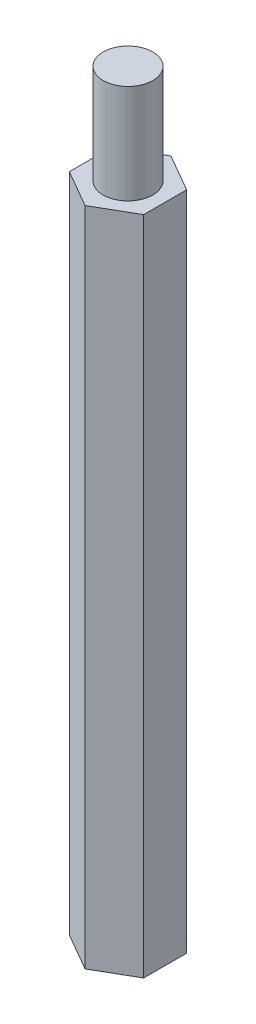
ISO-10303-21;
HEADER;
FILE_DESCRIPTION(('STEP AP214'),'2;1');
FILE_NAME('part.step','',(''),(''),'','','');
FILE_SCHEMA(('AUTOMOTIVE_DESIGN { 1 0 10303 214 1 1 1 1 }'));
ENDSEC;
DATA;
#1=APPLICATION_CONTEXT('core data for automotive mechanical design processes');
#2=APPLICATION_PROTOCOL_DEFINITION('international standard','automotive_design',2000,#1);
#3=PRODUCT_CONTEXT('',#1,'mechanical');
#4=PRODUCT('Part','Part','',(#3));
#5=PRODUCT_RELATED_PRODUCT_CATEGORY('part','',(#4));
#6=PRODUCT_DEFINITION_FORMATION('','',#4);
#7=PRODUCT_DEFINITION_CONTEXT('part definition',#1,'design');
#8=PRODUCT_DEFINITION('design','',#6,#7);
#9=PRODUCT_DEFINITION_SHAPE('','',#8);
#10=(LENGTH_UNIT() NAMED_UNIT(*) SI_UNIT(.MILLI.,.METRE.));
#11=(NAMED_UNIT(*) PLANE_ANGLE_UNIT() SI_UNIT($,.RADIAN.));
#12=(NAMED_UNIT(*) SI_UNIT($,.STERADIAN.) SOLID_ANGLE_UNIT());
#13=UNCERTAINTY_MEASURE_WITH_UNIT(LENGTH_MEASURE(1.E-05),#10,'distance_accuracy_value','');
#14=(GEOMETRIC_REPRESENTATION_CONTEXT(3) GLOBAL_UNCERTAINTY_ASSIGNED_CONTEXT((#13)) GLOBAL_UNIT_ASSIGNED_CONTEXT((#10,
#11,#12)) REPRESENTATION_CONTEXT('',''));
#15=CARTESIAN_POINT('',(0.,0.,0.));
#16=DIRECTION('',(0.,0.,1.));
#17=DIRECTION('',(1.,0.,0.));
#18=AXIS2_PLACEMENT_3D('',#15,#16,#17);
#19=CARTESIAN_POINT('',(0.,46.,0.));
#20=DIRECTION('',(0.,-1.,0.));
#21=DIRECTION('',(0.,0.,-1.));
#22=AXIS2_PLACEMENT_3D('',#19,#20,#21);
#23=CYLINDRICAL_SURFACE('',#22,1.5);
#24=CARTESIAN_POINT('',(0.,46.,0.));
#25=DIRECTION('',(0.,1.,0.));
#26=DIRECTION('',(0.,0.,1.));
#27=AXIS2_PLACEMENT_3D('',#24,#25,#26);
#28=CIRCLE('',#27,1.5);
#29=CARTESIAN_POINT('',(0.,46.,1.5));
#30=VERTEX_POINT('',#29);
#31=EDGE_CURVE('E11',#30,#30,#28,.T.);
#32=ORIENTED_EDGE('',*,*,#31,.F.);
#33=EDGE_LOOP('',(#32));
#34=FACE_BOUND('',#33,.T.);
#35=CARTESIAN_POINT('',(0.,40.,0.));
#36=DIRECTION('',(0.,1.,0.));
#37=DIRECTION('',(0.,0.,1.));
#38=AXIS2_PLACEMENT_3D('',#35,#36,#37);
#39=CIRCLE('',#38,1.5);
#40=CARTESIAN_POINT('',(0.,40.,1.5));
#41=VERTEX_POINT('',#40);
#42=EDGE_CURVE('E43',#41,#41,#39,.T.);
#43=ORIENTED_EDGE('',*,*,#42,.T.);
#44=EDGE_LOOP('',(#43));
#45=FACE_BOUND('',#44,.T.);
#46=ADVANCED_FACE('F40',(#34,#45),#23,.T.);
#47=CARTESIAN_POINT('',(0.,46.,0.));
#48=DIRECTION('',(0.,1.,0.));
#49=DIRECTION('',(0.,0.,1.));
#50=AXIS2_PLACEMENT_3D('',#47,#48,#49);
#51=PLANE('',#50);
#52=ORIENTED_EDGE('',*,*,#31,.T.);
#53=EDGE_LOOP('',(#52));
#54=FACE_BOUND('',#53,.T.);
#55=ADVANCED_FACE('F55',(#54),#51,.T.);
#56=CARTESIAN_POINT('',(0.,40.,0.));
#57=DIRECTION('',(0.,1.,0.));
#58=DIRECTION('',(0.,0.,1.));
#59=AXIS2_PLACEMENT_3D('',#56,#57,#58);
#60=PLANE('',#59);
#61=ORIENTED_EDGE('',*,*,#42,.F.);
#62=EDGE_LOOP('',(#61));
#63=FACE_BOUND('',#62,.T.);
#64=ADVANCED_FACE('F53',(#63),#60,.F.);
#65=CLOSED_SHELL('',(#46,#55,#64));
#66=MANIFOLD_SOLID_BREP('B2',#65);
#67=CARTESIAN_POINT('',(2.24999999999998,40.,-1.29903810567668));
#68=DIRECTION('',(-0.499999999999995,0.,0.866025403784442));
#69=DIRECTION('',(0.866025403784442,0.,0.499999999999995));
#70=AXIS2_PLACEMENT_3D('',#67,#68,#69);
#71=PLANE('',#70);
#72=DIRECTION('',(-0.866025403784441,0.,-0.499999999999995));
#73=VECTOR('',#72,1.);
#74=CARTESIAN_POINT('',(2.24999999999998,0.,-1.29903810567668));
#75=LINE('',#74,#73);
#76=CARTESIAN_POINT('',(2.24999999999998,0.,-1.29903810567668));
#77=VERTEX_POINT('',#76);
#78=CARTESIAN_POINT('',(0.,0.,-2.59807621135331));
#79=VERTEX_POINT('',#78);
#80=EDGE_CURVE('E164',#77,#79,#75,.T.);
#81=ORIENTED_EDGE('',*,*,#80,.T.);
#82=DIRECTION('',(0.,-1.,0.));
#83=VECTOR('',#82,1.);
#84=CARTESIAN_POINT('',(0.,40.,-2.59807621135331));
#85=LINE('',#84,#83);
#86=CARTESIAN_POINT('',(0.,40.,-2.59807621135331));
#87=VERTEX_POINT('',#86);
#88=EDGE_CURVE('E38',#87,#79,#85,.T.);
#89=ORIENTED_EDGE('',*,*,#88,.F.);
#90=DIRECTION('',(-0.866025403784441,0.,-0.499999999999995));
#91=VECTOR('',#90,1.);
#92=CARTESIAN_POINT('',(2.24999999999998,40.,-1.29903810567668));
#93=LINE('',#92,#91);
#94=CARTESIAN_POINT('',(2.24999999999998,40.,-1.29903810567668));
#95=VERTEX_POINT('',#94);
#96=EDGE_CURVE('E175',#95,#87,#93,.T.);
#97=ORIENTED_EDGE('',*,*,#96,.F.);
#98=DIRECTION('',(0.,-1.,0.));
#99=VECTOR('',#98,1.);
#100=CARTESIAN_POINT('',(2.24999999999998,40.,-1.29903810567668));
#101=LINE('',#100,#99);
#102=EDGE_CURVE('E160',#95,#77,#101,.T.);
#103=ORIENTED_EDGE('',*,*,#102,.T.);
#104=EDGE_LOOP('',(#81,#89,#97,#103));
#105=FACE_BOUND('',#104,.T.);
#106=ADVANCED_FACE('F80',(#105),#71,.F.);
#107=CARTESIAN_POINT('',(0.,40.,-2.59807621135331));
#108=DIRECTION('',(0.500000000000001,0.,0.866025403784438));
#109=DIRECTION('',(0.866025403784438,0.,-0.500000000000001));
#110=AXIS2_PLACEMENT_3D('',#107,#108,#109);
#111=PLANE('',#110);
#112=DIRECTION('',(-0.866025403784438,0.,0.500000000000001));
#113=VECTOR('',#112,1.);
#114=CARTESIAN_POINT('',(0.,0.,-2.59807621135331));
#115=LINE('',#114,#113);
#116=CARTESIAN_POINT('',(-2.25,0.,-1.29903810567665));
#117=VERTEX_POINT('',#116);
#118=EDGE_CURVE('E167',#79,#117,#115,.T.);
#119=ORIENTED_EDGE('',*,*,#118,.T.);
#120=DIRECTION('',(0.,-1.,0.));
#121=VECTOR('',#120,1.);
#122=CARTESIAN_POINT('',(-2.25,40.,-1.29903810567665));
#123=LINE('',#122,#121);
#124=CARTESIAN_POINT('',(-2.25,40.,-1.29903810567665));
#125=VERTEX_POINT('',#124);
#126=EDGE_CURVE('E88',#125,#117,#123,.T.);
#127=ORIENTED_EDGE('',*,*,#126,.F.);
#128=DIRECTION('',(-0.866025403784438,0.,0.500000000000001));
#129=VECTOR('',#128,1.);
#130=CARTESIAN_POINT('',(0.,40.,-2.59807621135331));
#131=LINE('',#130,#129);
#132=EDGE_CURVE('E133',#87,#125,#131,.T.);
#133=ORIENTED_EDGE('',*,*,#132,.F.);
#134=ORIENTED_EDGE('',*,*,#88,.T.);
#135=EDGE_LOOP('',(#119,#127,#133,#134));
#136=FACE_BOUND('',#135,.T.);
#137=ADVANCED_FACE('F200',(#136),#111,.F.);
#138=CARTESIAN_POINT('',(-2.25,40.,-1.29903810567665));
#139=DIRECTION('',(1.,0.,0.));
#140=DIRECTION('',(0.,0.,-1.));
#141=AXIS2_PLACEMENT_3D('',#138,#139,#140);
#142=PLANE('',#141);
#143=DIRECTION('',(0.,0.,1.));
#144=VECTOR('',#143,1.);
#145=CARTESIAN_POINT('',(-2.25,0.,-1.29903810567665));
#146=LINE('',#145,#144);
#147=CARTESIAN_POINT('',(-2.24999999999999,0.,1.29903810567667));
#148=VERTEX_POINT('',#147);
#149=EDGE_CURVE('E170',#117,#148,#146,.T.);
#150=ORIENTED_EDGE('',*,*,#149,.T.);
#151=DIRECTION('',(0.,-1.,0.));
#152=VECTOR('',#151,1.);
#153=CARTESIAN_POINT('',(-2.24999999999999,40.,1.29903810567667));
#154=LINE('',#153,#152);
#155=CARTESIAN_POINT('',(-2.24999999999999,40.,1.29903810567667));
#156=VERTEX_POINT('',#155);
#157=EDGE_CURVE('E155',#156,#148,#154,.T.);
#158=ORIENTED_EDGE('',*,*,#157,.F.);
#159=DIRECTION('',(0.,0.,1.));
#160=VECTOR('',#159,1.);
#161=CARTESIAN_POINT('',(-2.25,40.,-1.29903810567665));
#162=LINE('',#161,#160);
#163=EDGE_CURVE('E146',#125,#156,#162,.T.);
#164=ORIENTED_EDGE('',*,*,#163,.F.);
#165=ORIENTED_EDGE('',*,*,#126,.T.);
#166=EDGE_LOOP('',(#150,#158,#164,#165));
#167=FACE_BOUND('',#166,.T.);
#168=ADVANCED_FACE('F181',(#167),#142,.F.);
#169=CARTESIAN_POINT('',(-2.24999999999999,40.,1.29903810567667));
#170=DIRECTION('',(0.499999999999995,0.,-0.866025403784442));
#171=DIRECTION('',(-0.866025403784442,0.,-0.499999999999995));
#172=AXIS2_PLACEMENT_3D('',#169,#170,#171);
#173=PLANE('',#172);
#174=DIRECTION('',(0.866025403784442,0.,0.499999999999995));
#175=VECTOR('',#174,1.);
#176=CARTESIAN_POINT('',(-2.24999999999999,0.,1.29903810567667));
#177=LINE('',#176,#175);
#178=CARTESIAN_POINT('',(0.,0.,2.59807621135331));
#179=VERTEX_POINT('',#178);
#180=EDGE_CURVE('E154',#148,#179,#177,.T.);
#181=ORIENTED_EDGE('',*,*,#180,.T.);
#182=DIRECTION('',(0.,-1.,0.));
#183=VECTOR('',#182,1.);
#184=CARTESIAN_POINT('',(0.,40.,2.59807621135331));
#185=LINE('',#184,#183);
#186=CARTESIAN_POINT('',(0.,40.,2.59807621135331));
#187=VERTEX_POINT('',#186);
#188=EDGE_CURVE('E151',#187,#179,#185,.T.);
#189=ORIENTED_EDGE('',*,*,#188,.F.);
#190=DIRECTION('',(0.866025403784442,0.,0.499999999999995));
#191=VECTOR('',#190,1.);
#192=CARTESIAN_POINT('',(-2.24999999999999,40.,1.29903810567667));
#193=LINE('',#192,#191);
#194=EDGE_CURVE('E140',#156,#187,#193,.T.);
#195=ORIENTED_EDGE('',*,*,#194,.F.);
#196=ORIENTED_EDGE('',*,*,#157,.T.);
#197=EDGE_LOOP('',(#181,#189,#195,#196));
#198=FACE_BOUND('',#197,.T.);
#199=ADVANCED_FACE('F152',(#198),#173,.F.);
#200=CARTESIAN_POINT('',(0.,40.,2.59807621135331));
#201=DIRECTION('',(-0.500000000000007,0.,-0.866025403784434));
#202=DIRECTION('',(-0.866025403784434,0.,0.500000000000007));
#203=AXIS2_PLACEMENT_3D('',#200,#201,#202);
#204=PLANE('',#203);
#205=DIRECTION('',(0.866025403784434,0.,-0.500000000000007));
#206=VECTOR('',#205,1.);
#207=CARTESIAN_POINT('',(0.,0.,2.59807621135331));
#208=LINE('',#207,#206);
#209=CARTESIAN_POINT('',(2.25000000000001,0.,1.29903810567663));
#210=VERTEX_POINT('',#209);
#211=EDGE_CURVE('E119',#179,#210,#208,.T.);
#212=ORIENTED_EDGE('',*,*,#211,.T.);
#213=DIRECTION('',(0.,-1.,0.));
#214=VECTOR('',#213,1.);
#215=CARTESIAN_POINT('',(2.25000000000001,40.,1.29903810567663));
#216=LINE('',#215,#214);
#217=CARTESIAN_POINT('',(2.25000000000001,40.,1.29903810567663));
#218=VERTEX_POINT('',#217);
#219=EDGE_CURVE('E156',#218,#210,#216,.T.);
#220=ORIENTED_EDGE('',*,*,#219,.F.);
#221=DIRECTION('',(0.866025403784434,0.,-0.500000000000007));
#222=VECTOR('',#221,1.);
#223=CARTESIAN_POINT('',(0.,40.,2.59807621135331));
#224=LINE('',#223,#222);
#225=EDGE_CURVE('E144',#187,#218,#224,.T.);
#226=ORIENTED_EDGE('',*,*,#225,.F.);
#227=ORIENTED_EDGE('',*,*,#188,.T.);
#228=EDGE_LOOP('',(#212,#220,#226,#227));
#229=FACE_BOUND('',#228,.T.);
#230=ADVANCED_FACE('F158',(#229),#204,.F.);
#231=CARTESIAN_POINT('',(2.25000000000001,40.,1.29903810567663));
#232=DIRECTION('',(-1.,0.,0.));
#233=DIRECTION('',(0.,0.,1.));
#234=AXIS2_PLACEMENT_3D('',#231,#232,#233);
#235=PLANE('',#234);
#236=DIRECTION('',(0.,0.,-1.));
#237=VECTOR('',#236,1.);
#238=CARTESIAN_POINT('',(2.25000000000001,0.,1.29903810567663));
#239=LINE('',#238,#237);
#240=EDGE_CURVE('E125',#210,#77,#239,.T.);
#241=ORIENTED_EDGE('',*,*,#240,.T.);
#242=ORIENTED_EDGE('',*,*,#102,.F.);
#243=DIRECTION('',(0.,0.,-1.));
#244=VECTOR('',#243,1.);
#245=CARTESIAN_POINT('',(2.25000000000001,40.,1.29903810567663));
#246=LINE('',#245,#244);
#247=EDGE_CURVE('E96',#218,#95,#246,.T.);
#248=ORIENTED_EDGE('',*,*,#247,.F.);
#249=ORIENTED_EDGE('',*,*,#219,.T.);
#250=EDGE_LOOP('',(#241,#242,#248,#249));
#251=FACE_BOUND('',#250,.T.);
#252=ADVANCED_FACE('F188',(#251),#235,.F.);
#253=CARTESIAN_POINT('',(0.,40.,0.));
#254=DIRECTION('',(0.,1.,0.));
#255=DIRECTION('',(0.,0.,1.));
#256=AXIS2_PLACEMENT_3D('',#253,#254,#255);
#257=PLANE('',#256);
#258=CARTESIAN_POINT('',(0.,40.,0.));
#259=DIRECTION('',(0.,1.,0.));
#260=DIRECTION('',(0.,0.,1.));
#261=AXIS2_PLACEMENT_3D('',#258,#259,#260);
#262=CIRCLE('',#261,1.5);
#263=CARTESIAN_POINT('',(0.,40.,1.5));
#264=VERTEX_POINT('',#263);
#265=EDGE_CURVE('E255',#264,#264,#262,.T.);
#266=ORIENTED_EDGE('',*,*,#265,.F.);
#267=EDGE_LOOP('',(#266));
#268=FACE_BOUND('',#267,.T.);
#269=ORIENTED_EDGE('',*,*,#96,.T.);
#270=ORIENTED_EDGE('',*,*,#132,.T.);
#271=ORIENTED_EDGE('',*,*,#163,.T.);
#272=ORIENTED_EDGE('',*,*,#194,.T.);
#273=ORIENTED_EDGE('',*,*,#225,.T.);
#274=ORIENTED_EDGE('',*,*,#247,.T.);
#275=EDGE_LOOP('',(#269,#270,#271,#272,#273,#274));
#276=FACE_BOUND('',#275,.T.);
#277=ADVANCED_FACE('F142',(#268,#276),#257,.T.);
#278=CARTESIAN_POINT('',(0.,0.,0.));
#279=DIRECTION('',(0.,1.,0.));
#280=DIRECTION('',(0.,0.,1.));
#281=AXIS2_PLACEMENT_3D('',#278,#279,#280);
#282=PLANE('',#281);
#283=CARTESIAN_POINT('',(0.,0.,0.));
#284=DIRECTION('',(0.,1.,0.));
#285=DIRECTION('',(0.,0.,1.));
#286=AXIS2_PLACEMENT_3D('',#283,#284,#285);
#287=CIRCLE('',#286,1.5);
#288=CARTESIAN_POINT('',(0.,0.,1.5));
#289=VERTEX_POINT('',#288);
#290=EDGE_CURVE('E168',#289,#289,#287,.T.);
#291=ORIENTED_EDGE('',*,*,#290,.T.);
#292=EDGE_LOOP('',(#291));
#293=FACE_BOUND('',#292,.T.);
#294=ORIENTED_EDGE('',*,*,#80,.F.);
#295=ORIENTED_EDGE('',*,*,#240,.F.);
#296=ORIENTED_EDGE('',*,*,#211,.F.);
#297=ORIENTED_EDGE('',*,*,#180,.F.);
#298=ORIENTED_EDGE('',*,*,#149,.F.);
#299=ORIENTED_EDGE('',*,*,#118,.F.);
#300=EDGE_LOOP('',(#294,#295,#296,#297,#298,#299));
#301=FACE_BOUND('',#300,.T.);
#302=ADVANCED_FACE('F184',(#293,#301),#282,.F.);
#303=CARTESIAN_POINT('',(0.,0.,0.));
#304=DIRECTION('',(0.,1.,0.));
#305=DIRECTION('',(0.,0.,1.));
#306=AXIS2_PLACEMENT_3D('',#303,#304,#305);
#307=CYLINDRICAL_SURFACE('',#306,1.5);
#308=ORIENTED_EDGE('',*,*,#290,.F.);
#309=EDGE_LOOP('',(#308));
#310=FACE_BOUND('',#309,.T.);
#311=ORIENTED_EDGE('',*,*,#265,.T.);
#312=EDGE_LOOP('',(#311));
#313=FACE_BOUND('',#312,.T.);
#314=ADVANCED_FACE('F237',(#310,#313),#307,.F.);
#315=CLOSED_SHELL('',(#106,#137,#168,#199,#230,#252,#277,#302,#314));
#316=MANIFOLD_SOLID_BREP('B6',#315);
#317=ADVANCED_BREP_SHAPE_REPRESENTATION('',(#18,#66,#316),#14);
#318=SHAPE_DEFINITION_REPRESENTATION(#9,#317);
ENDSEC;
END-ISO-10303-21;
